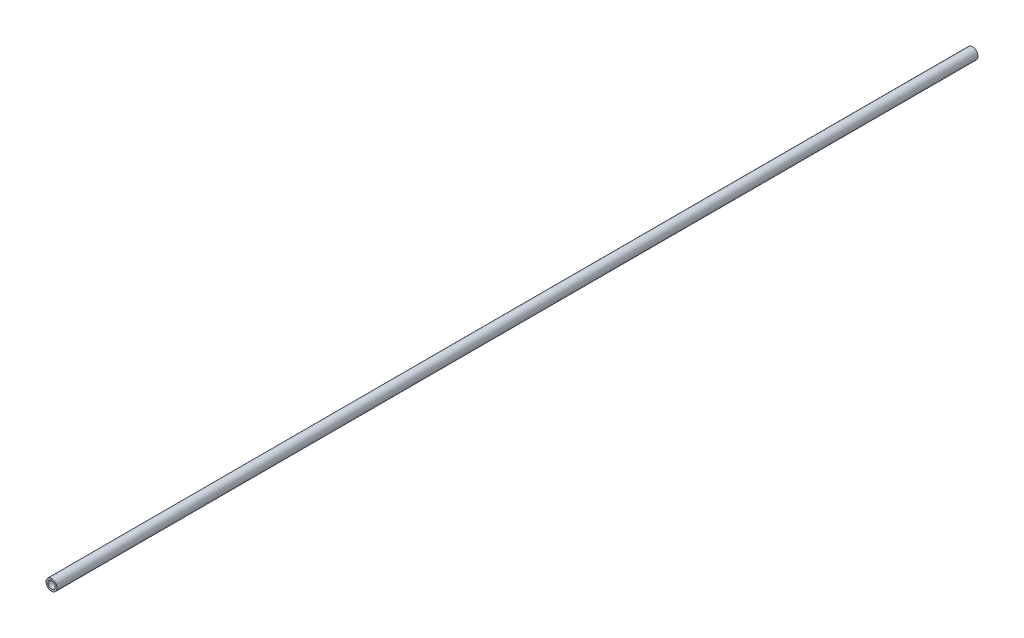
ISO-10303-21;
HEADER;
FILE_DESCRIPTION(('STEP AP214'),'2;1');
FILE_NAME('part.step','',(''),(''),'','','');
FILE_SCHEMA(('AUTOMOTIVE_DESIGN { 1 0 10303 214 1 1 1 1 }'));
ENDSEC;
DATA;
#1=APPLICATION_CONTEXT('core data for automotive mechanical design processes');
#2=APPLICATION_PROTOCOL_DEFINITION('international standard','automotive_design',2000,#1);
#3=PRODUCT_CONTEXT('',#1,'mechanical');
#4=PRODUCT('Part','Part','',(#3));
#5=PRODUCT_RELATED_PRODUCT_CATEGORY('part','',(#4));
#6=PRODUCT_DEFINITION_FORMATION('','',#4);
#7=PRODUCT_DEFINITION_CONTEXT('part definition',#1,'design');
#8=PRODUCT_DEFINITION('design','',#6,#7);
#9=PRODUCT_DEFINITION_SHAPE('','',#8);
#10=(LENGTH_UNIT() NAMED_UNIT(*) SI_UNIT(.MILLI.,.METRE.));
#11=(NAMED_UNIT(*) PLANE_ANGLE_UNIT() SI_UNIT($,.RADIAN.));
#12=(NAMED_UNIT(*) SI_UNIT($,.STERADIAN.) SOLID_ANGLE_UNIT());
#13=UNCERTAINTY_MEASURE_WITH_UNIT(LENGTH_MEASURE(1.E-05),#10,'distance_accuracy_value','');
#14=(GEOMETRIC_REPRESENTATION_CONTEXT(3) GLOBAL_UNCERTAINTY_ASSIGNED_CONTEXT((#13)) GLOBAL_UNIT_ASSIGNED_CONTEXT((#10,
#11,#12)) REPRESENTATION_CONTEXT('',''));
#15=CARTESIAN_POINT('',(0.,0.,0.));
#16=DIRECTION('',(0.,0.,1.));
#17=DIRECTION('',(1.,0.,0.));
#18=AXIS2_PLACEMENT_3D('',#15,#16,#17);
#19=CARTESIAN_POINT('',(0.,0.,500.));
#20=DIRECTION('',(0.,0.,1.));
#21=DIRECTION('',(1.,0.,0.));
#22=AXIS2_PLACEMENT_3D('',#19,#20,#21);
#23=PLANE('',#22);
#24=CARTESIAN_POINT('',(0.,0.,500.));
#25=DIRECTION('',(0.,0.,1.));
#26=DIRECTION('',(1.,0.,0.));
#27=AXIS2_PLACEMENT_3D('',#24,#25,#26);
#28=CIRCLE('',#27,3.);
#29=CARTESIAN_POINT('',(3.,0.,500.));
#30=VERTEX_POINT('',#29);
#31=EDGE_CURVE('E10',#30,#30,#28,.T.);
#32=ORIENTED_EDGE('',*,*,#31,.T.);
#33=EDGE_LOOP('',(#32));
#34=FACE_BOUND('',#33,.T.);
#35=CARTESIAN_POINT('',(0.,0.,500.));
#36=DIRECTION('',(0.,0.,1.));
#37=DIRECTION('',(1.,0.,0.));
#38=AXIS2_PLACEMENT_3D('',#35,#36,#37);
#39=CIRCLE('',#38,2.);
#40=CARTESIAN_POINT('',(2.,0.,500.));
#41=VERTEX_POINT('',#40);
#42=EDGE_CURVE('E48',#41,#41,#39,.T.);
#43=ORIENTED_EDGE('',*,*,#42,.F.);
#44=EDGE_LOOP('',(#43));
#45=FACE_BOUND('',#44,.T.);
#46=ADVANCED_FACE('F37',(#34,#45),#23,.T.);
#47=CARTESIAN_POINT('',(0.,0.,0.));
#48=DIRECTION('',(0.,0.,1.));
#49=DIRECTION('',(1.,0.,0.));
#50=AXIS2_PLACEMENT_3D('',#47,#48,#49);
#51=PLANE('',#50);
#52=CARTESIAN_POINT('',(0.,0.,0.));
#53=DIRECTION('',(0.,0.,1.));
#54=DIRECTION('',(1.,0.,0.));
#55=AXIS2_PLACEMENT_3D('',#52,#53,#54);
#56=CIRCLE('',#55,3.);
#57=CARTESIAN_POINT('',(3.,0.,0.));
#58=VERTEX_POINT('',#57);
#59=EDGE_CURVE('E41',#58,#58,#56,.T.);
#60=ORIENTED_EDGE('',*,*,#59,.F.);
#61=EDGE_LOOP('',(#60));
#62=FACE_BOUND('',#61,.T.);
#63=CARTESIAN_POINT('',(0.,0.,0.));
#64=DIRECTION('',(0.,0.,1.));
#65=DIRECTION('',(1.,0.,0.));
#66=AXIS2_PLACEMENT_3D('',#63,#64,#65);
#67=CIRCLE('',#66,2.);
#68=CARTESIAN_POINT('',(2.,0.,0.));
#69=VERTEX_POINT('',#68);
#70=EDGE_CURVE('E50',#69,#69,#67,.T.);
#71=ORIENTED_EDGE('',*,*,#70,.T.);
#72=EDGE_LOOP('',(#71));
#73=FACE_BOUND('',#72,.T.);
#74=ADVANCED_FACE('F60',(#62,#73),#51,.F.);
#75=CARTESIAN_POINT('',(0.,0.,500.));
#76=DIRECTION('',(0.,0.,-1.));
#77=DIRECTION('',(-1.,0.,0.));
#78=AXIS2_PLACEMENT_3D('',#75,#76,#77);
#79=CYLINDRICAL_SURFACE('',#78,3.);
#80=ORIENTED_EDGE('',*,*,#31,.F.);
#81=EDGE_LOOP('',(#80));
#82=FACE_BOUND('',#81,.T.);
#83=ORIENTED_EDGE('',*,*,#59,.T.);
#84=EDGE_LOOP('',(#83));
#85=FACE_BOUND('',#84,.T.);
#86=ADVANCED_FACE('F39',(#82,#85),#79,.T.);
#87=CARTESIAN_POINT('',(0.,0.,500.));
#88=DIRECTION('',(0.,0.,-1.));
#89=DIRECTION('',(-1.,0.,0.));
#90=AXIS2_PLACEMENT_3D('',#87,#88,#89);
#91=CYLINDRICAL_SURFACE('',#90,2.);
#92=ORIENTED_EDGE('',*,*,#42,.T.);
#93=EDGE_LOOP('',(#92));
#94=FACE_BOUND('',#93,.T.);
#95=ORIENTED_EDGE('',*,*,#70,.F.);
#96=EDGE_LOOP('',(#95));
#97=FACE_BOUND('',#96,.T.);
#98=ADVANCED_FACE('F56',(#94,#97),#91,.F.);
#99=CLOSED_SHELL('',(#46,#74,#86,#98));
#100=MANIFOLD_SOLID_BREP('B2',#99);
#101=ADVANCED_BREP_SHAPE_REPRESENTATION('',(#18,#100),#14);
#102=SHAPE_DEFINITION_REPRESENTATION(#9,#101);
ENDSEC;
END-ISO-10303-21;
